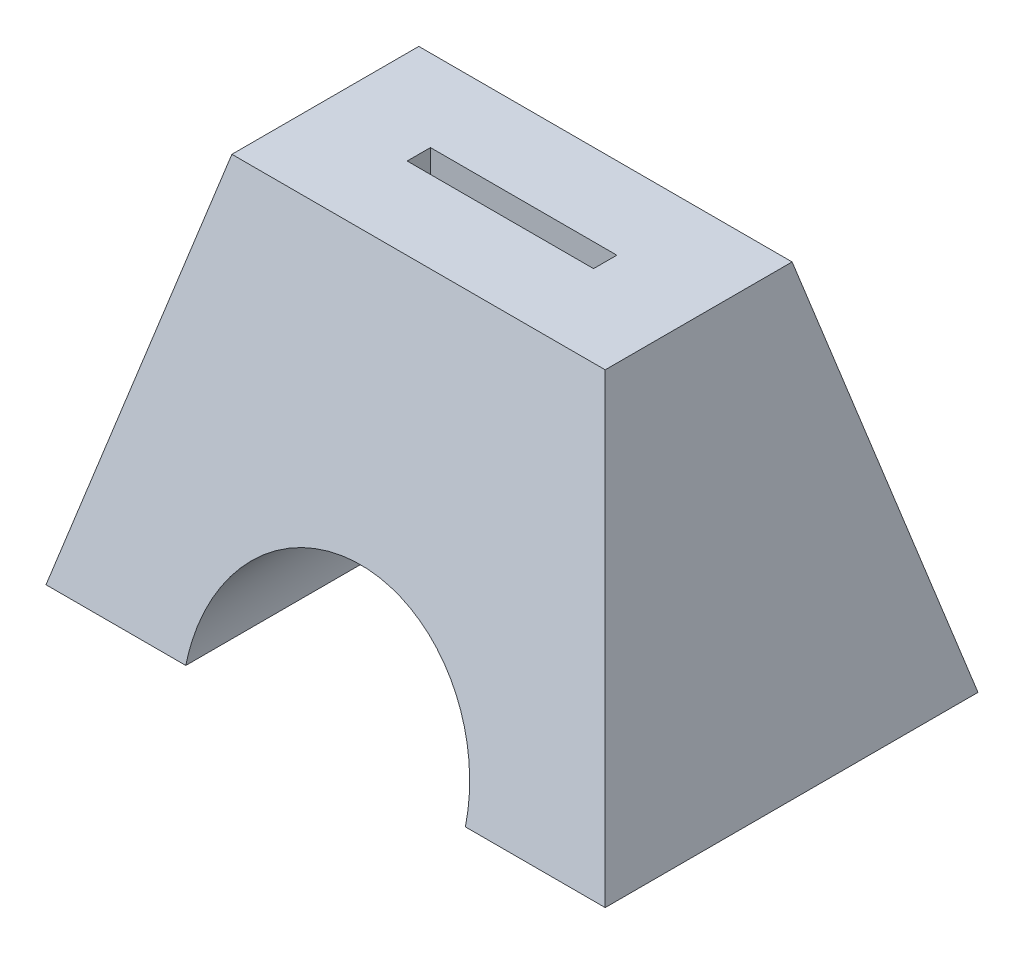
ISO-10303-21;
HEADER;
FILE_DESCRIPTION(('STEP AP214'),'2;1');
FILE_NAME('part.step','',(''),(''),'','','');
FILE_SCHEMA(('AUTOMOTIVE_DESIGN { 1 0 10303 214 1 1 1 1 }'));
ENDSEC;
DATA;
#1=APPLICATION_CONTEXT('core data for automotive mechanical design processes');
#2=APPLICATION_PROTOCOL_DEFINITION('international standard','automotive_design',2000,#1);
#3=PRODUCT_CONTEXT('',#1,'mechanical');
#4=PRODUCT('Part','Part','',(#3));
#5=PRODUCT_RELATED_PRODUCT_CATEGORY('part','',(#4));
#6=PRODUCT_DEFINITION_FORMATION('','',#4);
#7=PRODUCT_DEFINITION_CONTEXT('part definition',#1,'design');
#8=PRODUCT_DEFINITION('design','',#6,#7);
#9=PRODUCT_DEFINITION_SHAPE('','',#8);
#10=(LENGTH_UNIT() NAMED_UNIT(*) SI_UNIT(.MILLI.,.METRE.));
#11=(NAMED_UNIT(*) PLANE_ANGLE_UNIT() SI_UNIT($,.RADIAN.));
#12=(NAMED_UNIT(*) SI_UNIT($,.STERADIAN.) SOLID_ANGLE_UNIT());
#13=UNCERTAINTY_MEASURE_WITH_UNIT(LENGTH_MEASURE(1.E-05),#10,'distance_accuracy_value','');
#14=(GEOMETRIC_REPRESENTATION_CONTEXT(3) GLOBAL_UNCERTAINTY_ASSIGNED_CONTEXT((#13)) GLOBAL_UNIT_ASSIGNED_CONTEXT((#10,
#11,#12)) REPRESENTATION_CONTEXT('',''));
#15=CARTESIAN_POINT('',(0.,0.,0.));
#16=DIRECTION('',(0.,0.,1.));
#17=DIRECTION('',(1.,0.,0.));
#18=AXIS2_PLACEMENT_3D('',#15,#16,#17);
#19=CARTESIAN_POINT('',(0.,0.,0.));
#20=DIRECTION('',(0.,1.,0.));
#21=DIRECTION('',(0.,0.,1.));
#22=AXIS2_PLACEMENT_3D('',#19,#20,#21);
#23=PLANE('',#22);
#24=DIRECTION('',(-1.,0.,0.));
#25=VECTOR('',#24,1.);
#26=CARTESIAN_POINT('',(60.,0.,-40.));
#27=LINE('',#26,#25);
#28=CARTESIAN_POINT('',(-30.,0.,-40.));
#29=VERTEX_POINT('',#28);
#30=CARTESIAN_POINT('',(-60.,0.,-40.));
#31=VERTEX_POINT('',#30);
#32=EDGE_CURVE('E136',#29,#31,#27,.T.);
#33=ORIENTED_EDGE('',*,*,#32,.F.);
#34=DIRECTION('',(0.,0.,1.));
#35=VECTOR('',#34,1.);
#36=CARTESIAN_POINT('',(-30.,0.,-40.));
#37=LINE('',#36,#35);
#38=CARTESIAN_POINT('',(-30.,0.,40.));
#39=VERTEX_POINT('',#38);
#40=EDGE_CURVE('E11',#29,#39,#37,.T.);
#41=ORIENTED_EDGE('',*,*,#40,.T.);
#42=DIRECTION('',(1.,0.,0.));
#43=VECTOR('',#42,1.);
#44=CARTESIAN_POINT('',(60.,0.,40.));
#45=LINE('',#44,#43);
#46=CARTESIAN_POINT('',(-60.,0.,40.));
#47=VERTEX_POINT('',#46);
#48=EDGE_CURVE('E123',#47,#39,#45,.T.);
#49=ORIENTED_EDGE('',*,*,#48,.F.);
#50=DIRECTION('',(0.,0.,1.));
#51=VECTOR('',#50,1.);
#52=CARTESIAN_POINT('',(-60.,0.,40.));
#53=LINE('',#52,#51);
#54=EDGE_CURVE('E128',#31,#47,#53,.T.);
#55=ORIENTED_EDGE('',*,*,#54,.F.);
#56=EDGE_LOOP('',(#33,#41,#49,#55));
#57=FACE_BOUND('',#56,.T.);
#58=ADVANCED_FACE('F33',(#57),#23,.F.);
#59=CARTESIAN_POINT('',(0.,80.,0.));
#60=DIRECTION('',(0.,1.,0.));
#61=DIRECTION('',(0.,0.,1.));
#62=AXIS2_PLACEMENT_3D('',#59,#60,#61);
#63=PLANE('',#62);
#64=DIRECTION('',(0.,0.,-1.));
#65=VECTOR('',#64,1.);
#66=CARTESIAN_POINT('',(-40.0537597725455,80.,40.));
#67=LINE('',#66,#65);
#68=CARTESIAN_POINT('',(-40.0537597725455,80.,-20.0537597725456));
#69=VERTEX_POINT('',#68);
#70=CARTESIAN_POINT('',(-40.0537597725455,80.,20.0537597725455));
#71=VERTEX_POINT('',#70);
#72=EDGE_CURVE('E139',#69,#71,#67,.F.);
#73=ORIENTED_EDGE('',*,*,#72,.T.);
#74=DIRECTION('',(-1.,0.,0.));
#75=VECTOR('',#74,1.);
#76=CARTESIAN_POINT('',(60.,80.,20.0537597725455));
#77=LINE('',#76,#75);
#78=CARTESIAN_POINT('',(40.0537597725455,80.,20.0537597725455));
#79=VERTEX_POINT('',#78);
#80=EDGE_CURVE('E152',#71,#79,#77,.F.);
#81=ORIENTED_EDGE('',*,*,#80,.T.);
#82=DIRECTION('',(0.,0.,1.));
#83=VECTOR('',#82,1.);
#84=CARTESIAN_POINT('',(40.0537597725455,80.,40.));
#85=LINE('',#84,#83);
#86=CARTESIAN_POINT('',(40.0537597725455,80.,-20.0537597725456));
#87=VERTEX_POINT('',#86);
#88=EDGE_CURVE('E154',#79,#87,#85,.F.);
#89=ORIENTED_EDGE('',*,*,#88,.T.);
#90=DIRECTION('',(1.,0.,0.));
#91=VECTOR('',#90,1.);
#92=CARTESIAN_POINT('',(60.,80.,-20.0537597725456));
#93=LINE('',#92,#91);
#94=EDGE_CURVE('E146',#87,#69,#93,.F.);
#95=ORIENTED_EDGE('',*,*,#94,.T.);
#96=EDGE_LOOP('',(#73,#81,#89,#95));
#97=FACE_BOUND('',#96,.T.);
#98=DIRECTION('',(0.,0.,1.));
#99=VECTOR('',#98,1.);
#100=CARTESIAN_POINT('',(20.,80.,0.));
#101=LINE('',#100,#99);
#102=CARTESIAN_POINT('',(20.,80.,-2.5));
#103=VERTEX_POINT('',#102);
#104=CARTESIAN_POINT('',(20.,80.,2.5));
#105=VERTEX_POINT('',#104);
#106=EDGE_CURVE('E289',#103,#105,#101,.T.);
#107=ORIENTED_EDGE('',*,*,#106,.T.);
#108=DIRECTION('',(-1.,0.,0.));
#109=VECTOR('',#108,1.);
#110=CARTESIAN_POINT('',(0.,80.,2.5));
#111=LINE('',#110,#109);
#112=CARTESIAN_POINT('',(-20.,80.,2.5));
#113=VERTEX_POINT('',#112);
#114=EDGE_CURVE('E56',#105,#113,#111,.T.);
#115=ORIENTED_EDGE('',*,*,#114,.T.);
#116=DIRECTION('',(0.,0.,-1.));
#117=VECTOR('',#116,1.);
#118=CARTESIAN_POINT('',(-20.,80.,0.));
#119=LINE('',#118,#117);
#120=CARTESIAN_POINT('',(-20.,80.,-2.5));
#121=VERTEX_POINT('',#120);
#122=EDGE_CURVE('E301',#113,#121,#119,.T.);
#123=ORIENTED_EDGE('',*,*,#122,.T.);
#124=DIRECTION('',(1.,0.,0.));
#125=VECTOR('',#124,1.);
#126=CARTESIAN_POINT('',(0.,80.,-2.5));
#127=LINE('',#126,#125);
#128=EDGE_CURVE('E294',#121,#103,#127,.T.);
#129=ORIENTED_EDGE('',*,*,#128,.T.);
#130=EDGE_LOOP('',(#107,#115,#123,#129));
#131=FACE_BOUND('',#130,.T.);
#132=ADVANCED_FACE('F159',(#97,#131),#63,.T.);
#133=CARTESIAN_POINT('',(-60.,0.,40.));
#134=DIRECTION('',(-0.970295726275996,0.241921895599668,0.));
#135=DIRECTION('',(-0.241921895599668,-0.970295726275996,0.));
#136=AXIS2_PLACEMENT_3D('',#133,#134,#135);
#137=PLANE('',#136);
#138=ORIENTED_EDGE('',*,*,#54,.T.);
#139=DIRECTION('',(-0.235138839312811,-0.943090373449569,0.235138839312811));
#140=VECTOR('',#139,1.);
#141=CARTESIAN_POINT('',(-53.3651671495949,26.610861093602,33.3651671495949));
#142=LINE('',#141,#140);
#143=EDGE_CURVE('E116',#71,#47,#142,.T.);
#144=ORIENTED_EDGE('',*,*,#143,.F.);
#145=ORIENTED_EDGE('',*,*,#72,.F.);
#146=DIRECTION('',(-0.235138839312811,-0.943090373449569,-0.235138839312811));
#147=VECTOR('',#146,1.);
#148=CARTESIAN_POINT('',(-55.5767780997299,17.7405740624014,-35.57677809973));
#149=LINE('',#148,#147);
#150=EDGE_CURVE('E142',#69,#31,#149,.T.);
#151=ORIENTED_EDGE('',*,*,#150,.T.);
#152=EDGE_LOOP('',(#138,#144,#145,#151));
#153=FACE_BOUND('',#152,.T.);
#154=ADVANCED_FACE('F170',(#153),#137,.T.);
#155=CARTESIAN_POINT('',(60.,0.,40.));
#156=DIRECTION('',(0.,0.241921895599668,0.970295726275996));
#157=DIRECTION('',(0.,-0.970295726275996,0.241921895599668));
#158=AXIS2_PLACEMENT_3D('',#155,#156,#157);
#159=PLANE('',#158);
#160=ORIENTED_EDGE('',*,*,#48,.T.);
#161=CARTESIAN_POINT('',(0.,0.,40.));
#162=DIRECTION('',(0.,0.241921895599668,0.970295726275996));
#163=DIRECTION('',(0.,-0.970295726275996,0.241921895599668));
#164=AXIS2_PLACEMENT_3D('',#161,#162,#163);
#165=ELLIPSE('',#164,30.9184088804969,30.);
#166=CARTESIAN_POINT('',(30.,0.,40.));
#167=VERTEX_POINT('',#166);
#168=EDGE_CURVE('E111',#39,#167,#165,.F.);
#169=ORIENTED_EDGE('',*,*,#168,.T.);
#170=CARTESIAN_POINT('',(60.,0.,40.));
#171=VERTEX_POINT('',#170);
#172=EDGE_CURVE('E120',#167,#171,#45,.T.);
#173=ORIENTED_EDGE('',*,*,#172,.T.);
#174=DIRECTION('',(0.235138839312811,-0.943090373449569,0.235138839312811));
#175=VECTOR('',#174,1.);
#176=CARTESIAN_POINT('',(60.,0.,40.));
#177=LINE('',#176,#175);
#178=EDGE_CURVE('E141',#79,#171,#177,.T.);
#179=ORIENTED_EDGE('',*,*,#178,.F.);
#180=ORIENTED_EDGE('',*,*,#80,.F.);
#181=ORIENTED_EDGE('',*,*,#143,.T.);
#182=EDGE_LOOP('',(#160,#169,#173,#179,#180,#181));
#183=FACE_BOUND('',#182,.T.);
#184=ADVANCED_FACE('F35',(#183),#159,.T.);
#185=CARTESIAN_POINT('',(60.,0.,40.));
#186=DIRECTION('',(0.970295726275996,0.241921895599668,0.));
#187=DIRECTION('',(-0.241921895599668,0.970295726275996,0.));
#188=AXIS2_PLACEMENT_3D('',#185,#186,#187);
#189=PLANE('',#188);
#190=DIRECTION('',(0.,0.,-1.));
#191=VECTOR('',#190,1.);
#192=CARTESIAN_POINT('',(60.,0.,40.));
#193=LINE('',#192,#191);
#194=CARTESIAN_POINT('',(60.,0.,-40.));
#195=VERTEX_POINT('',#194);
#196=EDGE_CURVE('E127',#171,#195,#193,.T.);
#197=ORIENTED_EDGE('',*,*,#196,.T.);
#198=DIRECTION('',(0.235138839312811,-0.943090373449569,-0.235138839312811));
#199=VECTOR('',#198,1.);
#200=CARTESIAN_POINT('',(60.,0.,-40.));
#201=LINE('',#200,#199);
#202=EDGE_CURVE('E145',#87,#195,#201,.T.);
#203=ORIENTED_EDGE('',*,*,#202,.F.);
#204=ORIENTED_EDGE('',*,*,#88,.F.);
#205=ORIENTED_EDGE('',*,*,#178,.T.);
#206=EDGE_LOOP('',(#197,#203,#204,#205));
#207=FACE_BOUND('',#206,.T.);
#208=ADVANCED_FACE('F172',(#207),#189,.T.);
#209=CARTESIAN_POINT('',(60.,0.,-40.));
#210=DIRECTION('',(0.,0.241921895599668,-0.970295726275996));
#211=DIRECTION('',(0.,0.970295726275996,0.241921895599668));
#212=AXIS2_PLACEMENT_3D('',#209,#210,#211);
#213=PLANE('',#212);
#214=CARTESIAN_POINT('',(30.,0.,-40.));
#215=VERTEX_POINT('',#214);
#216=EDGE_CURVE('E137',#195,#215,#27,.T.);
#217=ORIENTED_EDGE('',*,*,#216,.T.);
#218=CARTESIAN_POINT('',(0.,0.,-40.));
#219=DIRECTION('',(0.,0.241921895599668,-0.970295726275996));
#220=DIRECTION('',(0.,0.970295726275996,0.241921895599668));
#221=AXIS2_PLACEMENT_3D('',#218,#219,#220);
#222=ELLIPSE('',#221,30.9184088804969,30.);
#223=EDGE_CURVE('E48',#215,#29,#222,.F.);
#224=ORIENTED_EDGE('',*,*,#223,.T.);
#225=ORIENTED_EDGE('',*,*,#32,.T.);
#226=ORIENTED_EDGE('',*,*,#150,.F.);
#227=ORIENTED_EDGE('',*,*,#94,.F.);
#228=ORIENTED_EDGE('',*,*,#202,.T.);
#229=EDGE_LOOP('',(#217,#224,#225,#226,#227,#228));
#230=FACE_BOUND('',#229,.T.);
#231=ADVANCED_FACE('F166',(#230),#213,.T.);
#232=ORIENTED_EDGE('',*,*,#172,.F.);
#233=DIRECTION('',(0.,0.,1.));
#234=VECTOR('',#233,1.);
#235=CARTESIAN_POINT('',(30.,0.,-40.));
#236=LINE('',#235,#234);
#237=EDGE_CURVE('E41',#167,#215,#236,.F.);
#238=ORIENTED_EDGE('',*,*,#237,.T.);
#239=ORIENTED_EDGE('',*,*,#216,.F.);
#240=ORIENTED_EDGE('',*,*,#196,.F.);
#241=EDGE_LOOP('',(#232,#238,#239,#240));
#242=FACE_BOUND('',#241,.T.);
#243=ADVANCED_FACE('F126',(#242),#23,.F.);
#244=CARTESIAN_POINT('',(0.,60.,2.5));
#245=DIRECTION('',(0.,0.,-1.));
#246=DIRECTION('',(-1.,0.,0.));
#247=AXIS2_PLACEMENT_3D('',#244,#245,#246);
#248=PLANE('',#247);
#249=ORIENTED_EDGE('',*,*,#114,.F.);
#250=DIRECTION('',(0.,1.,0.));
#251=VECTOR('',#250,1.);
#252=CARTESIAN_POINT('',(20.,60.,2.5));
#253=LINE('',#252,#251);
#254=CARTESIAN_POINT('',(20.,60.,2.5));
#255=VERTEX_POINT('',#254);
#256=EDGE_CURVE('E299',#255,#105,#253,.T.);
#257=ORIENTED_EDGE('',*,*,#256,.F.);
#258=DIRECTION('',(-1.,0.,0.));
#259=VECTOR('',#258,1.);
#260=CARTESIAN_POINT('',(0.,60.,2.5));
#261=LINE('',#260,#259);
#262=CARTESIAN_POINT('',(-20.,60.,2.5));
#263=VERTEX_POINT('',#262);
#264=EDGE_CURVE('E284',#255,#263,#261,.T.);
#265=ORIENTED_EDGE('',*,*,#264,.T.);
#266=DIRECTION('',(0.,1.,0.));
#267=VECTOR('',#266,1.);
#268=CARTESIAN_POINT('',(-20.,60.,2.5));
#269=LINE('',#268,#267);
#270=EDGE_CURVE('E131',#263,#113,#269,.T.);
#271=ORIENTED_EDGE('',*,*,#270,.T.);
#272=EDGE_LOOP('',(#249,#257,#265,#271));
#273=FACE_BOUND('',#272,.T.);
#274=ADVANCED_FACE('F183',(#273),#248,.T.);
#275=CARTESIAN_POINT('',(-20.,60.,0.));
#276=DIRECTION('',(1.,0.,0.));
#277=DIRECTION('',(0.,0.,-1.));
#278=AXIS2_PLACEMENT_3D('',#275,#276,#277);
#279=PLANE('',#278);
#280=ORIENTED_EDGE('',*,*,#122,.F.);
#281=ORIENTED_EDGE('',*,*,#270,.F.);
#282=DIRECTION('',(0.,0.,-1.));
#283=VECTOR('',#282,1.);
#284=CARTESIAN_POINT('',(-20.,60.,0.));
#285=LINE('',#284,#283);
#286=CARTESIAN_POINT('',(-20.,60.,-2.5));
#287=VERTEX_POINT('',#286);
#288=EDGE_CURVE('E287',#263,#287,#285,.T.);
#289=ORIENTED_EDGE('',*,*,#288,.T.);
#290=DIRECTION('',(0.,1.,0.));
#291=VECTOR('',#290,1.);
#292=CARTESIAN_POINT('',(-20.,60.,-2.5));
#293=LINE('',#292,#291);
#294=EDGE_CURVE('E309',#287,#121,#293,.T.);
#295=ORIENTED_EDGE('',*,*,#294,.T.);
#296=EDGE_LOOP('',(#280,#281,#289,#295));
#297=FACE_BOUND('',#296,.T.);
#298=ADVANCED_FACE('F188',(#297),#279,.T.);
#299=CARTESIAN_POINT('',(0.,60.,-2.5));
#300=DIRECTION('',(0.,0.,1.));
#301=DIRECTION('',(1.,0.,0.));
#302=AXIS2_PLACEMENT_3D('',#299,#300,#301);
#303=PLANE('',#302);
#304=ORIENTED_EDGE('',*,*,#128,.F.);
#305=ORIENTED_EDGE('',*,*,#294,.F.);
#306=DIRECTION('',(1.,0.,0.));
#307=VECTOR('',#306,1.);
#308=CARTESIAN_POINT('',(0.,60.,-2.5));
#309=LINE('',#308,#307);
#310=CARTESIAN_POINT('',(20.,60.,-2.5));
#311=VERTEX_POINT('',#310);
#312=EDGE_CURVE('E291',#287,#311,#309,.T.);
#313=ORIENTED_EDGE('',*,*,#312,.T.);
#314=DIRECTION('',(0.,1.,0.));
#315=VECTOR('',#314,1.);
#316=CARTESIAN_POINT('',(20.,60.,-2.5));
#317=LINE('',#316,#315);
#318=EDGE_CURVE('E307',#311,#103,#317,.T.);
#319=ORIENTED_EDGE('',*,*,#318,.T.);
#320=EDGE_LOOP('',(#304,#305,#313,#319));
#321=FACE_BOUND('',#320,.T.);
#322=ADVANCED_FACE('F229',(#321),#303,.T.);
#323=CARTESIAN_POINT('',(20.,60.,0.));
#324=DIRECTION('',(-1.,0.,0.));
#325=DIRECTION('',(0.,0.,1.));
#326=AXIS2_PLACEMENT_3D('',#323,#324,#325);
#327=PLANE('',#326);
#328=ORIENTED_EDGE('',*,*,#106,.F.);
#329=ORIENTED_EDGE('',*,*,#318,.F.);
#330=DIRECTION('',(0.,0.,1.));
#331=VECTOR('',#330,1.);
#332=CARTESIAN_POINT('',(20.,60.,0.));
#333=LINE('',#332,#331);
#334=EDGE_CURVE('E286',#311,#255,#333,.T.);
#335=ORIENTED_EDGE('',*,*,#334,.T.);
#336=ORIENTED_EDGE('',*,*,#256,.T.);
#337=EDGE_LOOP('',(#328,#329,#335,#336));
#338=FACE_BOUND('',#337,.T.);
#339=ADVANCED_FACE('F239',(#338),#327,.T.);
#340=CARTESIAN_POINT('',(0.,60.,0.));
#341=DIRECTION('',(0.,-1.,0.));
#342=DIRECTION('',(0.,0.,-1.));
#343=AXIS2_PLACEMENT_3D('',#340,#341,#342);
#344=PLANE('',#343);
#345=ORIENTED_EDGE('',*,*,#264,.F.);
#346=ORIENTED_EDGE('',*,*,#334,.F.);
#347=ORIENTED_EDGE('',*,*,#312,.F.);
#348=ORIENTED_EDGE('',*,*,#288,.F.);
#349=EDGE_LOOP('',(#345,#346,#347,#348));
#350=FACE_BOUND('',#349,.T.);
#351=ADVANCED_FACE('F249',(#350),#344,.F.);
#352=CARTESIAN_POINT('',(0.,0.,-40.));
#353=DIRECTION('',(0.,0.,1.));
#354=DIRECTION('',(1.,0.,0.));
#355=AXIS2_PLACEMENT_3D('',#352,#353,#354);
#356=CYLINDRICAL_SURFACE('',#355,30.);
#357=ORIENTED_EDGE('',*,*,#223,.F.);
#358=ORIENTED_EDGE('',*,*,#237,.F.);
#359=ORIENTED_EDGE('',*,*,#168,.F.);
#360=ORIENTED_EDGE('',*,*,#40,.F.);
#361=EDGE_LOOP('',(#357,#358,#359,#360));
#362=FACE_BOUND('',#361,.T.);
#363=ADVANCED_FACE('F110',(#362),#356,.F.);
#364=CLOSED_SHELL('',(#58,#132,#154,#184,#208,#231,#243,#274,#298,#322,#339,#351,#363));
#365=MANIFOLD_SOLID_BREP('B2',#364);
#366=ADVANCED_BREP_SHAPE_REPRESENTATION('',(#18,#365),#14);
#367=SHAPE_DEFINITION_REPRESENTATION(#9,#366);
ENDSEC;
END-ISO-10303-21;
